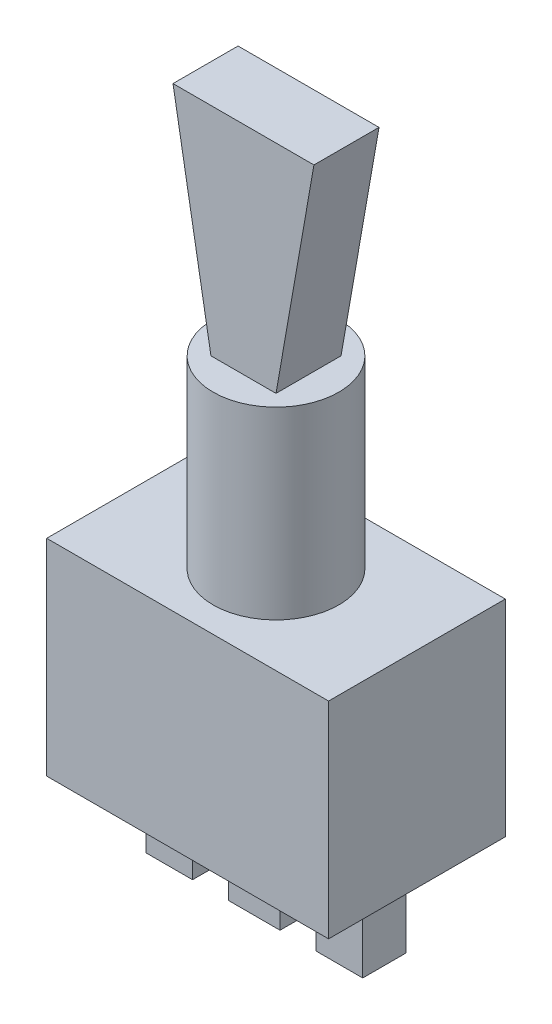
ISO-10303-21;
HEADER;
FILE_DESCRIPTION(('STEP AP214'),'2;1');
FILE_NAME('part.step','',(''),(''),'','','');
FILE_SCHEMA(('AUTOMOTIVE_DESIGN { 1 0 10303 214 1 1 1 1 }'));
ENDSEC;
DATA;
#1=APPLICATION_CONTEXT('core data for automotive mechanical design processes');
#2=APPLICATION_PROTOCOL_DEFINITION('international standard','automotive_design',2000,#1);
#3=PRODUCT_CONTEXT('',#1,'mechanical');
#4=PRODUCT('Part','Part','',(#3));
#5=PRODUCT_RELATED_PRODUCT_CATEGORY('part','',(#4));
#6=PRODUCT_DEFINITION_FORMATION('','',#4);
#7=PRODUCT_DEFINITION_CONTEXT('part definition',#1,'design');
#8=PRODUCT_DEFINITION('design','',#6,#7);
#9=PRODUCT_DEFINITION_SHAPE('','',#8);
#10=(LENGTH_UNIT() NAMED_UNIT(*) SI_UNIT(.MILLI.,.METRE.));
#11=(NAMED_UNIT(*) PLANE_ANGLE_UNIT() SI_UNIT($,.RADIAN.));
#12=(NAMED_UNIT(*) SI_UNIT($,.STERADIAN.) SOLID_ANGLE_UNIT());
#13=UNCERTAINTY_MEASURE_WITH_UNIT(LENGTH_MEASURE(1.E-05),#10,'distance_accuracy_value','');
#14=(GEOMETRIC_REPRESENTATION_CONTEXT(3) GLOBAL_UNCERTAINTY_ASSIGNED_CONTEXT((#13)) GLOBAL_UNIT_ASSIGNED_CONTEXT((#10,
#11,#12)) REPRESENTATION_CONTEXT('',''));
#15=CARTESIAN_POINT('',(0.,0.,0.));
#16=DIRECTION('',(0.,0.,1.));
#17=DIRECTION('',(1.,0.,0.));
#18=AXIS2_PLACEMENT_3D('',#15,#16,#17);
#19=CARTESIAN_POINT('',(-5.,-13.35,1.));
#20=DIRECTION('',(0.,0.,-1.));
#21=DIRECTION('',(-1.,0.,0.));
#22=AXIS2_PLACEMENT_3D('',#19,#20,#21);
#23=PLANE('',#22);
#24=DIRECTION('',(-1.,0.,0.));
#25=VECTOR('',#24,1.);
#26=CARTESIAN_POINT('',(-5.,-13.35,1.));
#27=LINE('',#26,#25);
#28=CARTESIAN_POINT('',(-2.84872806599769,-13.35,1.));
#29=VERTEX_POINT('',#28);
#30=CARTESIAN_POINT('',(-5.,-13.35,1.));
#31=VERTEX_POINT('',#30);
#32=EDGE_CURVE('E245',#29,#31,#27,.T.);
#33=ORIENTED_EDGE('',*,*,#32,.F.);
#34=DIRECTION('',(0.,1.,0.));
#35=VECTOR('',#34,1.);
#36=CARTESIAN_POINT('',(-2.84872806599769,-13.35,1.));
#37=LINE('',#36,#35);
#38=CARTESIAN_POINT('',(-2.84872806599769,-9.5,1.));
#39=VERTEX_POINT('',#38);
#40=EDGE_CURVE('E258',#29,#39,#37,.T.);
#41=ORIENTED_EDGE('',*,*,#40,.T.);
#42=DIRECTION('',(-1.,0.,0.));
#43=VECTOR('',#42,1.);
#44=CARTESIAN_POINT('',(-5.,-9.5,1.));
#45=LINE('',#44,#43);
#46=CARTESIAN_POINT('',(-5.,-9.5,1.));
#47=VERTEX_POINT('',#46);
#48=EDGE_CURVE('E270',#39,#47,#45,.T.);
#49=ORIENTED_EDGE('',*,*,#48,.T.);
#50=DIRECTION('',(0.,1.,0.));
#51=VECTOR('',#50,1.);
#52=CARTESIAN_POINT('',(-5.,-13.35,1.));
#53=LINE('',#52,#51);
#54=EDGE_CURVE('E288',#31,#47,#53,.T.);
#55=ORIENTED_EDGE('',*,*,#54,.F.);
#56=EDGE_LOOP('',(#33,#41,#49,#55));
#57=FACE_BOUND('',#56,.T.);
#58=ADVANCED_FACE('F38',(#57),#23,.F.);
#59=CARTESIAN_POINT('',(1.18594295638461,-9.5,1.));
#60=VERTEX_POINT('',#59);
#61=CARTESIAN_POINT('',(-1.18594295638461,-9.5,1.));
#62=VERTEX_POINT('',#61);
#63=EDGE_CURVE('E272',#60,#62,#45,.T.);
#64=ORIENTED_EDGE('',*,*,#63,.T.);
#65=DIRECTION('',(0.,-1.,0.));
#66=VECTOR('',#65,1.);
#67=CARTESIAN_POINT('',(-1.18594295638461,-13.35,1.));
#68=LINE('',#67,#66);
#69=CARTESIAN_POINT('',(-1.18594295638461,-13.35,1.));
#70=VERTEX_POINT('',#69);
#71=EDGE_CURVE('E427',#62,#70,#68,.T.);
#72=ORIENTED_EDGE('',*,*,#71,.T.);
#73=CARTESIAN_POINT('',(1.18594295638461,-13.35,1.));
#74=VERTEX_POINT('',#73);
#75=EDGE_CURVE('E254',#74,#70,#27,.T.);
#76=ORIENTED_EDGE('',*,*,#75,.F.);
#77=DIRECTION('',(0.,1.,0.));
#78=VECTOR('',#77,1.);
#79=CARTESIAN_POINT('',(1.18594295638461,-13.35,1.));
#80=LINE('',#79,#78);
#81=EDGE_CURVE('E420',#74,#60,#80,.T.);
#82=ORIENTED_EDGE('',*,*,#81,.T.);
#83=EDGE_LOOP('',(#64,#72,#76,#82));
#84=FACE_BOUND('',#83,.T.);
#85=ADVANCED_FACE('F448',(#84),#23,.F.);
#86=CARTESIAN_POINT('',(-5.,-13.35,-1.));
#87=DIRECTION('',(0.,0.,1.));
#88=DIRECTION('',(1.,0.,0.));
#89=AXIS2_PLACEMENT_3D('',#86,#87,#88);
#90=PLANE('',#89);
#91=DIRECTION('',(1.,0.,0.));
#92=VECTOR('',#91,1.);
#93=CARTESIAN_POINT('',(-5.,-9.5,-1.));
#94=LINE('',#93,#92);
#95=CARTESIAN_POINT('',(-5.,-9.5,-1.));
#96=VERTEX_POINT('',#95);
#97=CARTESIAN_POINT('',(-2.84872806599769,-9.5,-1.));
#98=VERTEX_POINT('',#97);
#99=EDGE_CURVE('E231',#96,#98,#94,.T.);
#100=ORIENTED_EDGE('',*,*,#99,.T.);
#101=DIRECTION('',(0.,-1.,0.));
#102=VECTOR('',#101,1.);
#103=CARTESIAN_POINT('',(-2.84872806599769,-13.35,-1.));
#104=LINE('',#103,#102);
#105=CARTESIAN_POINT('',(-2.84872806599769,-13.35,-1.));
#106=VERTEX_POINT('',#105);
#107=EDGE_CURVE('E429',#98,#106,#104,.T.);
#108=ORIENTED_EDGE('',*,*,#107,.T.);
#109=DIRECTION('',(1.,0.,0.));
#110=VECTOR('',#109,1.);
#111=CARTESIAN_POINT('',(-5.,-13.35,-1.));
#112=LINE('',#111,#110);
#113=CARTESIAN_POINT('',(-5.,-13.35,-1.));
#114=VERTEX_POINT('',#113);
#115=EDGE_CURVE('E264',#114,#106,#112,.T.);
#116=ORIENTED_EDGE('',*,*,#115,.F.);
#117=DIRECTION('',(0.,1.,0.));
#118=VECTOR('',#117,1.);
#119=CARTESIAN_POINT('',(-5.,-13.35,-1.));
#120=LINE('',#119,#118);
#121=EDGE_CURVE('E297',#114,#96,#120,.T.);
#122=ORIENTED_EDGE('',*,*,#121,.T.);
#123=EDGE_LOOP('',(#100,#108,#116,#122));
#124=FACE_BOUND('',#123,.T.);
#125=ADVANCED_FACE('F431',(#124),#90,.F.);
#126=CARTESIAN_POINT('',(-1.18594295638461,-13.35,-1.));
#127=VERTEX_POINT('',#126);
#128=CARTESIAN_POINT('',(1.18594295638461,-13.35,-1.));
#129=VERTEX_POINT('',#128);
#130=EDGE_CURVE('E268',#127,#129,#112,.T.);
#131=ORIENTED_EDGE('',*,*,#130,.F.);
#132=DIRECTION('',(0.,1.,0.));
#133=VECTOR('',#132,1.);
#134=CARTESIAN_POINT('',(-1.18594295638461,-13.35,-1.));
#135=LINE('',#134,#133);
#136=CARTESIAN_POINT('',(-1.18594295638461,-9.5,-1.));
#137=VERTEX_POINT('',#136);
#138=EDGE_CURVE('E68',#127,#137,#135,.T.);
#139=ORIENTED_EDGE('',*,*,#138,.T.);
#140=CARTESIAN_POINT('',(1.18594295638461,-9.5,-1.));
#141=VERTEX_POINT('',#140);
#142=EDGE_CURVE('E228',#137,#141,#94,.T.);
#143=ORIENTED_EDGE('',*,*,#142,.T.);
#144=DIRECTION('',(0.,-1.,0.));
#145=VECTOR('',#144,1.);
#146=CARTESIAN_POINT('',(1.18594295638461,-13.35,-1.));
#147=LINE('',#146,#145);
#148=EDGE_CURVE('E410',#141,#129,#147,.T.);
#149=ORIENTED_EDGE('',*,*,#148,.T.);
#150=EDGE_LOOP('',(#131,#139,#143,#149));
#151=FACE_BOUND('',#150,.T.);
#152=ADVANCED_FACE('F408',(#151),#90,.F.);
#153=CARTESIAN_POINT('',(0.,-13.35,0.));
#154=DIRECTION('',(0.,1.,0.));
#155=DIRECTION('',(0.,0.,1.));
#156=AXIS2_PLACEMENT_3D('',#153,#154,#155);
#157=PLANE('',#156);
#158=ORIENTED_EDGE('',*,*,#115,.T.);
#159=DIRECTION('',(0.,0.,1.));
#160=VECTOR('',#159,1.);
#161=CARTESIAN_POINT('',(-2.84872806599769,-13.35,0.));
#162=LINE('',#161,#160);
#163=EDGE_CURVE('E11',#106,#29,#162,.T.);
#164=ORIENTED_EDGE('',*,*,#163,.T.);
#165=ORIENTED_EDGE('',*,*,#32,.T.);
#166=DIRECTION('',(0.,0.,-1.));
#167=VECTOR('',#166,1.);
#168=CARTESIAN_POINT('',(-5.,-13.35,-1.));
#169=LINE('',#168,#167);
#170=EDGE_CURVE('E262',#31,#114,#169,.T.);
#171=ORIENTED_EDGE('',*,*,#170,.T.);
#172=EDGE_LOOP('',(#158,#164,#165,#171));
#173=FACE_BOUND('',#172,.T.);
#174=ADVANCED_FACE('F434',(#173),#157,.F.);
#175=ORIENTED_EDGE('',*,*,#75,.T.);
#176=DIRECTION('',(0.,0.,-1.));
#177=VECTOR('',#176,1.);
#178=CARTESIAN_POINT('',(-1.18594295638461,-13.35,0.));
#179=LINE('',#178,#177);
#180=EDGE_CURVE('E47',#70,#127,#179,.T.);
#181=ORIENTED_EDGE('',*,*,#180,.T.);
#182=ORIENTED_EDGE('',*,*,#130,.T.);
#183=DIRECTION('',(0.,0.,1.));
#184=VECTOR('',#183,1.);
#185=CARTESIAN_POINT('',(1.18594295638461,-13.35,0.));
#186=LINE('',#185,#184);
#187=EDGE_CURVE('E394',#129,#74,#186,.T.);
#188=ORIENTED_EDGE('',*,*,#187,.T.);
#189=EDGE_LOOP('',(#175,#181,#182,#188));
#190=FACE_BOUND('',#189,.T.);
#191=ADVANCED_FACE('F403',(#190),#157,.F.);
#192=CARTESIAN_POINT('',(0.,8.5,0.));
#193=DIRECTION('',(0.,1.,0.));
#194=DIRECTION('',(0.,0.,1.));
#195=AXIS2_PLACEMENT_3D('',#192,#193,#194);
#196=PLANE('',#195);
#197=CARTESIAN_POINT('',(0.,8.5,0.));
#198=DIRECTION('',(0.,1.,0.));
#199=DIRECTION('',(0.,0.,1.));
#200=AXIS2_PLACEMENT_3D('',#197,#198,#199);
#201=CIRCLE('',#200,2.9);
#202=CARTESIAN_POINT('',(0.,8.5,2.9));
#203=VERTEX_POINT('',#202);
#204=EDGE_CURVE('E338',#203,#203,#201,.T.);
#205=ORIENTED_EDGE('',*,*,#204,.T.);
#206=EDGE_LOOP('',(#205));
#207=FACE_BOUND('',#206,.T.);
#208=DIRECTION('',(1.,0.,0.));
#209=VECTOR('',#208,1.);
#210=CARTESIAN_POINT('',(1.5,8.5,-1.5));
#211=LINE('',#210,#209);
#212=CARTESIAN_POINT('',(-1.5,8.5,-1.5));
#213=VERTEX_POINT('',#212);
#214=CARTESIAN_POINT('',(1.5,8.5,-1.5));
#215=VERTEX_POINT('',#214);
#216=EDGE_CURVE('E329',#213,#215,#211,.T.);
#217=ORIENTED_EDGE('',*,*,#216,.T.);
#218=DIRECTION('',(0.,0.,1.));
#219=VECTOR('',#218,1.);
#220=CARTESIAN_POINT('',(1.5,8.5,-1.5));
#221=LINE('',#220,#219);
#222=CARTESIAN_POINT('',(1.5,8.5,1.5));
#223=VERTEX_POINT('',#222);
#224=EDGE_CURVE('E334',#215,#223,#221,.T.);
#225=ORIENTED_EDGE('',*,*,#224,.T.);
#226=DIRECTION('',(1.,0.,0.));
#227=VECTOR('',#226,1.);
#228=CARTESIAN_POINT('',(1.5,8.5,1.5));
#229=LINE('',#228,#227);
#230=CARTESIAN_POINT('',(-1.5,8.5,1.5));
#231=VERTEX_POINT('',#230);
#232=EDGE_CURVE('E315',#231,#223,#229,.T.);
#233=ORIENTED_EDGE('',*,*,#232,.F.);
#234=DIRECTION('',(0.,0.,1.));
#235=VECTOR('',#234,1.);
#236=CARTESIAN_POINT('',(-1.5,8.5,-1.5));
#237=LINE('',#236,#235);
#238=EDGE_CURVE('E339',#213,#231,#237,.T.);
#239=ORIENTED_EDGE('',*,*,#238,.F.);
#240=EDGE_LOOP('',(#217,#225,#233,#239));
#241=FACE_BOUND('',#240,.T.);
#242=ADVANCED_FACE('F492',(#207,#241),#196,.T.);
#243=CARTESIAN_POINT('',(6.5,-9.5,4.075));
#244=DIRECTION('',(1.,0.,0.));
#245=DIRECTION('',(0.,0.,-1.));
#246=AXIS2_PLACEMENT_3D('',#243,#244,#245);
#247=PLANE('',#246);
#248=DIRECTION('',(0.,0.,-1.));
#249=VECTOR('',#248,1.);
#250=CARTESIAN_POINT('',(6.5,0.,4.075));
#251=LINE('',#250,#249);
#252=CARTESIAN_POINT('',(6.5,0.,4.075));
#253=VERTEX_POINT('',#252);
#254=CARTESIAN_POINT('',(6.5,0.,-4.075));
#255=VERTEX_POINT('',#254);
#256=EDGE_CURVE('E350',#253,#255,#251,.T.);
#257=ORIENTED_EDGE('',*,*,#256,.F.);
#258=DIRECTION('',(0.,1.,0.));
#259=VECTOR('',#258,1.);
#260=CARTESIAN_POINT('',(6.5,-9.5,4.075));
#261=LINE('',#260,#259);
#262=CARTESIAN_POINT('',(6.5,-9.5,4.075));
#263=VERTEX_POINT('',#262);
#264=EDGE_CURVE('E356',#263,#253,#261,.T.);
#265=ORIENTED_EDGE('',*,*,#264,.F.);
#266=DIRECTION('',(0.,0.,-1.));
#267=VECTOR('',#266,1.);
#268=CARTESIAN_POINT('',(6.5,-9.5,4.075));
#269=LINE('',#268,#267);
#270=CARTESIAN_POINT('',(6.5,-9.5,-4.075));
#271=VERTEX_POINT('',#270);
#272=EDGE_CURVE('E357',#263,#271,#269,.T.);
#273=ORIENTED_EDGE('',*,*,#272,.T.);
#274=DIRECTION('',(0.,1.,0.));
#275=VECTOR('',#274,1.);
#276=CARTESIAN_POINT('',(6.5,-9.5,-4.075));
#277=LINE('',#276,#275);
#278=EDGE_CURVE('E371',#271,#255,#277,.T.);
#279=ORIENTED_EDGE('',*,*,#278,.T.);
#280=EDGE_LOOP('',(#257,#265,#273,#279));
#281=FACE_BOUND('',#280,.T.);
#282=ADVANCED_FACE('F40',(#281),#247,.T.);
#283=CARTESIAN_POINT('',(-6.5,-9.5,4.075));
#284=DIRECTION('',(0.,0.,1.));
#285=DIRECTION('',(1.,0.,0.));
#286=AXIS2_PLACEMENT_3D('',#283,#284,#285);
#287=PLANE('',#286);
#288=DIRECTION('',(1.,0.,0.));
#289=VECTOR('',#288,1.);
#290=CARTESIAN_POINT('',(-6.5,0.,4.075));
#291=LINE('',#290,#289);
#292=CARTESIAN_POINT('',(-6.5,0.,4.075));
#293=VERTEX_POINT('',#292);
#294=EDGE_CURVE('E362',#293,#253,#291,.T.);
#295=ORIENTED_EDGE('',*,*,#294,.F.);
#296=DIRECTION('',(0.,1.,0.));
#297=VECTOR('',#296,1.);
#298=CARTESIAN_POINT('',(-6.5,-9.5,4.075));
#299=LINE('',#298,#297);
#300=CARTESIAN_POINT('',(-6.5,-9.5,4.075));
#301=VERTEX_POINT('',#300);
#302=EDGE_CURVE('E387',#301,#293,#299,.T.);
#303=ORIENTED_EDGE('',*,*,#302,.F.);
#304=DIRECTION('',(1.,0.,0.));
#305=VECTOR('',#304,1.);
#306=CARTESIAN_POINT('',(-6.5,-9.5,4.075));
#307=LINE('',#306,#305);
#308=EDGE_CURVE('E368',#301,#263,#307,.T.);
#309=ORIENTED_EDGE('',*,*,#308,.T.);
#310=ORIENTED_EDGE('',*,*,#264,.T.);
#311=EDGE_LOOP('',(#295,#303,#309,#310));
#312=FACE_BOUND('',#311,.T.);
#313=ADVANCED_FACE('F506',(#312),#287,.T.);
#314=CARTESIAN_POINT('',(-6.5,-9.5,4.075));
#315=DIRECTION('',(-1.,0.,0.));
#316=DIRECTION('',(0.,0.,1.));
#317=AXIS2_PLACEMENT_3D('',#314,#315,#316);
#318=PLANE('',#317);
#319=DIRECTION('',(0.,0.,1.));
#320=VECTOR('',#319,1.);
#321=CARTESIAN_POINT('',(-6.5,0.,4.075));
#322=LINE('',#321,#320);
#323=CARTESIAN_POINT('',(-6.5,0.,-4.075));
#324=VERTEX_POINT('',#323);
#325=EDGE_CURVE('E379',#324,#293,#322,.T.);
#326=ORIENTED_EDGE('',*,*,#325,.F.);
#327=DIRECTION('',(0.,1.,0.));
#328=VECTOR('',#327,1.);
#329=CARTESIAN_POINT('',(-6.5,-9.5,-4.075));
#330=LINE('',#329,#328);
#331=CARTESIAN_POINT('',(-6.5,-9.5,-4.075));
#332=VERTEX_POINT('',#331);
#333=EDGE_CURVE('E389',#332,#324,#330,.T.);
#334=ORIENTED_EDGE('',*,*,#333,.F.);
#335=DIRECTION('',(0.,0.,1.));
#336=VECTOR('',#335,1.);
#337=CARTESIAN_POINT('',(-6.5,-9.5,4.075));
#338=LINE('',#337,#336);
#339=EDGE_CURVE('E365',#332,#301,#338,.T.);
#340=ORIENTED_EDGE('',*,*,#339,.T.);
#341=ORIENTED_EDGE('',*,*,#302,.T.);
#342=EDGE_LOOP('',(#326,#334,#340,#341));
#343=FACE_BOUND('',#342,.T.);
#344=ADVANCED_FACE('F509',(#343),#318,.T.);
#345=CARTESIAN_POINT('',(-6.5,-9.5,-4.075));
#346=DIRECTION('',(0.,0.,-1.));
#347=DIRECTION('',(-1.,0.,0.));
#348=AXIS2_PLACEMENT_3D('',#345,#346,#347);
#349=PLANE('',#348);
#350=DIRECTION('',(-1.,0.,0.));
#351=VECTOR('',#350,1.);
#352=CARTESIAN_POINT('',(-6.5,0.,-4.075));
#353=LINE('',#352,#351);
#354=EDGE_CURVE('E375',#255,#324,#353,.T.);
#355=ORIENTED_EDGE('',*,*,#354,.F.);
#356=ORIENTED_EDGE('',*,*,#278,.F.);
#357=DIRECTION('',(-1.,0.,0.));
#358=VECTOR('',#357,1.);
#359=CARTESIAN_POINT('',(-6.5,-9.5,-4.075));
#360=LINE('',#359,#358);
#361=EDGE_CURVE('E361',#271,#332,#360,.T.);
#362=ORIENTED_EDGE('',*,*,#361,.T.);
#363=ORIENTED_EDGE('',*,*,#333,.T.);
#364=EDGE_LOOP('',(#355,#356,#362,#363));
#365=FACE_BOUND('',#364,.T.);
#366=ADVANCED_FACE('F502',(#365),#349,.T.);
#367=CARTESIAN_POINT('',(0.,-9.5,0.));
#368=DIRECTION('',(0.,-1.,0.));
#369=DIRECTION('',(0.,0.,-1.));
#370=AXIS2_PLACEMENT_3D('',#367,#368,#369);
#371=PLANE('',#370);
#372=ORIENTED_EDGE('',*,*,#48,.F.);
#373=DIRECTION('',(0.,0.,1.));
#374=VECTOR('',#373,1.);
#375=CARTESIAN_POINT('',(-2.84872806599769,-9.5,-4.075));
#376=LINE('',#375,#374);
#377=EDGE_CURVE('E220',#98,#39,#376,.T.);
#378=ORIENTED_EDGE('',*,*,#377,.F.);
#379=ORIENTED_EDGE('',*,*,#99,.F.);
#380=DIRECTION('',(0.,0.,-1.));
#381=VECTOR('',#380,1.);
#382=CARTESIAN_POINT('',(-5.,-9.5,-1.));
#383=LINE('',#382,#381);
#384=EDGE_CURVE('E229',#47,#96,#383,.T.);
#385=ORIENTED_EDGE('',*,*,#384,.F.);
#386=EDGE_LOOP('',(#372,#378,#379,#385));
#387=FACE_BOUND('',#386,.T.);
#388=ORIENTED_EDGE('',*,*,#142,.F.);
#389=DIRECTION('',(0.,0.,1.));
#390=VECTOR('',#389,1.);
#391=CARTESIAN_POINT('',(-1.18594295638461,-9.5,-4.075));
#392=LINE('',#391,#390);
#393=EDGE_CURVE('E436',#137,#62,#392,.T.);
#394=ORIENTED_EDGE('',*,*,#393,.T.);
#395=ORIENTED_EDGE('',*,*,#63,.F.);
#396=DIRECTION('',(0.,0.,1.));
#397=VECTOR('',#396,1.);
#398=CARTESIAN_POINT('',(1.18594295638461,-9.5,-4.075));
#399=LINE('',#398,#397);
#400=EDGE_CURVE('E210',#141,#60,#399,.T.);
#401=ORIENTED_EDGE('',*,*,#400,.F.);
#402=EDGE_LOOP('',(#388,#394,#395,#401));
#403=FACE_BOUND('',#402,.T.);
#404=CARTESIAN_POINT('',(2.84872806599769,-9.5,-1.));
#405=VERTEX_POINT('',#404);
#406=CARTESIAN_POINT('',(5.,-9.5,-1.));
#407=VERTEX_POINT('',#406);
#408=EDGE_CURVE('E216',#405,#407,#94,.T.);
#409=ORIENTED_EDGE('',*,*,#408,.F.);
#410=DIRECTION('',(0.,0.,1.));
#411=VECTOR('',#410,1.);
#412=CARTESIAN_POINT('',(2.84872806599769,-9.5,-4.075));
#413=LINE('',#412,#411);
#414=CARTESIAN_POINT('',(2.84872806599769,-9.5,1.));
#415=VERTEX_POINT('',#414);
#416=EDGE_CURVE('E202',#405,#415,#413,.T.);
#417=ORIENTED_EDGE('',*,*,#416,.T.);
#418=CARTESIAN_POINT('',(5.,-9.5,1.));
#419=VERTEX_POINT('',#418);
#420=EDGE_CURVE('E235',#419,#415,#45,.T.);
#421=ORIENTED_EDGE('',*,*,#420,.F.);
#422=DIRECTION('',(0.,0.,1.));
#423=VECTOR('',#422,1.);
#424=CARTESIAN_POINT('',(5.,-9.5,-1.));
#425=LINE('',#424,#423);
#426=EDGE_CURVE('E225',#407,#419,#425,.T.);
#427=ORIENTED_EDGE('',*,*,#426,.F.);
#428=EDGE_LOOP('',(#409,#417,#421,#427));
#429=FACE_BOUND('',#428,.T.);
#430=ORIENTED_EDGE('',*,*,#339,.F.);
#431=ORIENTED_EDGE('',*,*,#361,.F.);
#432=ORIENTED_EDGE('',*,*,#272,.F.);
#433=ORIENTED_EDGE('',*,*,#308,.F.);
#434=EDGE_LOOP('',(#430,#431,#432,#433));
#435=FACE_BOUND('',#434,.T.);
#436=ADVANCED_FACE('F222',(#387,#403,#429,#435),#371,.T.);
#437=CARTESIAN_POINT('',(0.,0.,0.));
#438=DIRECTION('',(0.,-1.,0.));
#439=DIRECTION('',(0.,0.,-1.));
#440=AXIS2_PLACEMENT_3D('',#437,#438,#439);
#441=PLANE('',#440);
#442=CARTESIAN_POINT('',(0.,0.,0.));
#443=DIRECTION('',(0.,1.,0.));
#444=DIRECTION('',(0.,0.,1.));
#445=AXIS2_PLACEMENT_3D('',#442,#443,#444);
#446=CIRCLE('',#445,2.9);
#447=CARTESIAN_POINT('',(0.,0.,2.9));
#448=VERTEX_POINT('',#447);
#449=EDGE_CURVE('E351',#448,#448,#446,.T.);
#450=ORIENTED_EDGE('',*,*,#449,.F.);
#451=EDGE_LOOP('',(#450));
#452=FACE_BOUND('',#451,.T.);
#453=ORIENTED_EDGE('',*,*,#256,.T.);
#454=ORIENTED_EDGE('',*,*,#354,.T.);
#455=ORIENTED_EDGE('',*,*,#325,.T.);
#456=ORIENTED_EDGE('',*,*,#294,.T.);
#457=EDGE_LOOP('',(#453,#454,#455,#456));
#458=FACE_BOUND('',#457,.T.);
#459=ADVANCED_FACE('F498',(#452,#458),#441,.F.);
#460=CARTESIAN_POINT('',(0.,8.5,0.));
#461=DIRECTION('',(0.,-1.,0.));
#462=DIRECTION('',(0.,0.,-1.));
#463=AXIS2_PLACEMENT_3D('',#460,#461,#462);
#464=CYLINDRICAL_SURFACE('',#463,2.9);
#465=ORIENTED_EDGE('',*,*,#204,.F.);
#466=EDGE_LOOP('',(#465));
#467=FACE_BOUND('',#466,.T.);
#468=ORIENTED_EDGE('',*,*,#449,.T.);
#469=EDGE_LOOP('',(#468));
#470=FACE_BOUND('',#469,.T.);
#471=ADVANCED_FACE('F490',(#467,#470),#464,.T.);
#472=CARTESIAN_POINT('',(1.5,8.5,-1.5));
#473=DIRECTION('',(0.985030467155704,-0.172380331752248,0.));
#474=DIRECTION('',(0.172380331752248,0.985030467155704,0.));
#475=AXIS2_PLACEMENT_3D('',#472,#473,#474);
#476=PLANE('',#475);
#477=DIRECTION('',(0.,0.,1.));
#478=VECTOR('',#477,1.);
#479=CARTESIAN_POINT('',(3.25,18.5,-1.5));
#480=LINE('',#479,#478);
#481=CARTESIAN_POINT('',(3.25,18.5,-1.5));
#482=VERTEX_POINT('',#481);
#483=CARTESIAN_POINT('',(3.25,18.5,1.5));
#484=VERTEX_POINT('',#483);
#485=EDGE_CURVE('E333',#482,#484,#480,.T.);
#486=ORIENTED_EDGE('',*,*,#485,.T.);
#487=DIRECTION('',(0.172380331752248,0.985030467155704,0.));
#488=VECTOR('',#487,1.);
#489=CARTESIAN_POINT('',(1.5,8.5,1.5));
#490=LINE('',#489,#488);
#491=EDGE_CURVE('E300',#223,#484,#490,.T.);
#492=ORIENTED_EDGE('',*,*,#491,.F.);
#493=ORIENTED_EDGE('',*,*,#224,.F.);
#494=DIRECTION('',(0.172380331752248,0.985030467155704,0.));
#495=VECTOR('',#494,1.);
#496=CARTESIAN_POINT('',(1.5,8.5,-1.5));
#497=LINE('',#496,#495);
#498=EDGE_CURVE('E318',#215,#482,#497,.T.);
#499=ORIENTED_EDGE('',*,*,#498,.T.);
#500=EDGE_LOOP('',(#486,#492,#493,#499));
#501=FACE_BOUND('',#500,.T.);
#502=ADVANCED_FACE('F483',(#501),#476,.T.);
#503=CARTESIAN_POINT('',(-1.5,8.5,-1.5));
#504=DIRECTION('',(-0.985030467155704,-0.172380331752248,0.));
#505=DIRECTION('',(0.172380331752248,-0.985030467155704,0.));
#506=AXIS2_PLACEMENT_3D('',#503,#504,#505);
#507=PLANE('',#506);
#508=ORIENTED_EDGE('',*,*,#238,.T.);
#509=DIRECTION('',(0.172380331752248,-0.985030467155704,0.));
#510=VECTOR('',#509,1.);
#511=CARTESIAN_POINT('',(-1.5,8.5,1.5));
#512=LINE('',#511,#510);
#513=CARTESIAN_POINT('',(-3.25,18.5,1.5));
#514=VERTEX_POINT('',#513);
#515=EDGE_CURVE('E311',#514,#231,#512,.T.);
#516=ORIENTED_EDGE('',*,*,#515,.F.);
#517=DIRECTION('',(0.,0.,1.));
#518=VECTOR('',#517,1.);
#519=CARTESIAN_POINT('',(-3.25,18.5,-1.5));
#520=LINE('',#519,#518);
#521=CARTESIAN_POINT('',(-3.25,18.5,-1.5));
#522=VERTEX_POINT('',#521);
#523=EDGE_CURVE('E342',#522,#514,#520,.T.);
#524=ORIENTED_EDGE('',*,*,#523,.F.);
#525=DIRECTION('',(0.172380331752248,-0.985030467155704,0.));
#526=VECTOR('',#525,1.);
#527=CARTESIAN_POINT('',(-1.5,8.5,-1.5));
#528=LINE('',#527,#526);
#529=EDGE_CURVE('E326',#522,#213,#528,.T.);
#530=ORIENTED_EDGE('',*,*,#529,.T.);
#531=EDGE_LOOP('',(#508,#516,#524,#530));
#532=FACE_BOUND('',#531,.T.);
#533=ADVANCED_FACE('F480',(#532),#507,.T.);
#534=CARTESIAN_POINT('',(3.25,18.5,-1.5));
#535=DIRECTION('',(0.,1.,0.));
#536=DIRECTION('',(0.,0.,1.));
#537=AXIS2_PLACEMENT_3D('',#534,#535,#536);
#538=PLANE('',#537);
#539=ORIENTED_EDGE('',*,*,#523,.T.);
#540=DIRECTION('',(-1.,0.,0.));
#541=VECTOR('',#540,1.);
#542=CARTESIAN_POINT('',(3.25,18.5,1.5));
#543=LINE('',#542,#541);
#544=EDGE_CURVE('E307',#484,#514,#543,.T.);
#545=ORIENTED_EDGE('',*,*,#544,.F.);
#546=ORIENTED_EDGE('',*,*,#485,.F.);
#547=DIRECTION('',(-1.,0.,0.));
#548=VECTOR('',#547,1.);
#549=CARTESIAN_POINT('',(3.25,18.5,-1.5));
#550=LINE('',#549,#548);
#551=EDGE_CURVE('E322',#482,#522,#550,.T.);
#552=ORIENTED_EDGE('',*,*,#551,.T.);
#553=EDGE_LOOP('',(#539,#545,#546,#552));
#554=FACE_BOUND('',#553,.T.);
#555=ADVANCED_FACE('F478',(#554),#538,.T.);
#556=CARTESIAN_POINT('',(0.,0.,-1.5));
#557=DIRECTION('',(0.,0.,1.));
#558=DIRECTION('',(1.,0.,0.));
#559=AXIS2_PLACEMENT_3D('',#556,#557,#558);
#560=PLANE('',#559);
#561=ORIENTED_EDGE('',*,*,#498,.F.);
#562=ORIENTED_EDGE('',*,*,#216,.F.);
#563=ORIENTED_EDGE('',*,*,#529,.F.);
#564=ORIENTED_EDGE('',*,*,#551,.F.);
#565=EDGE_LOOP('',(#561,#562,#563,#564));
#566=FACE_BOUND('',#565,.T.);
#567=ADVANCED_FACE('F472',(#566),#560,.F.);
#568=CARTESIAN_POINT('',(0.,0.,1.5));
#569=DIRECTION('',(0.,0.,1.));
#570=DIRECTION('',(1.,0.,0.));
#571=AXIS2_PLACEMENT_3D('',#568,#569,#570);
#572=PLANE('',#571);
#573=ORIENTED_EDGE('',*,*,#491,.T.);
#574=ORIENTED_EDGE('',*,*,#544,.T.);
#575=ORIENTED_EDGE('',*,*,#515,.T.);
#576=ORIENTED_EDGE('',*,*,#232,.T.);
#577=EDGE_LOOP('',(#573,#574,#575,#576));
#578=FACE_BOUND('',#577,.T.);
#579=ADVANCED_FACE('F468',(#578),#572,.T.);
#580=CARTESIAN_POINT('',(5.,-13.35,-1.));
#581=DIRECTION('',(-1.,0.,0.));
#582=DIRECTION('',(0.,0.,1.));
#583=AXIS2_PLACEMENT_3D('',#580,#581,#582);
#584=PLANE('',#583);
#585=ORIENTED_EDGE('',*,*,#426,.T.);
#586=DIRECTION('',(0.,1.,0.));
#587=VECTOR('',#586,1.);
#588=CARTESIAN_POINT('',(5.,-13.35,1.));
#589=LINE('',#588,#587);
#590=CARTESIAN_POINT('',(5.,-13.35,1.));
#591=VERTEX_POINT('',#590);
#592=EDGE_CURVE('E296',#591,#419,#589,.T.);
#593=ORIENTED_EDGE('',*,*,#592,.F.);
#594=DIRECTION('',(0.,0.,1.));
#595=VECTOR('',#594,1.);
#596=CARTESIAN_POINT('',(5.,-13.35,-1.));
#597=LINE('',#596,#595);
#598=CARTESIAN_POINT('',(5.,-13.35,-1.));
#599=VERTEX_POINT('',#598);
#600=EDGE_CURVE('E239',#599,#591,#597,.T.);
#601=ORIENTED_EDGE('',*,*,#600,.F.);
#602=DIRECTION('',(0.,1.,0.));
#603=VECTOR('',#602,1.);
#604=CARTESIAN_POINT('',(5.,-13.35,-1.));
#605=LINE('',#604,#603);
#606=EDGE_CURVE('E267',#599,#407,#605,.T.);
#607=ORIENTED_EDGE('',*,*,#606,.T.);
#608=EDGE_LOOP('',(#585,#593,#601,#607));
#609=FACE_BOUND('',#608,.T.);
#610=ADVANCED_FACE('F415',(#609),#584,.F.);
#611=ORIENTED_EDGE('',*,*,#420,.T.);
#612=DIRECTION('',(0.,-1.,0.));
#613=VECTOR('',#612,1.);
#614=CARTESIAN_POINT('',(2.84872806599769,-13.35,1.));
#615=LINE('',#614,#613);
#616=CARTESIAN_POINT('',(2.84872806599769,-13.35,1.));
#617=VERTEX_POINT('',#616);
#618=EDGE_CURVE('E205',#415,#617,#615,.T.);
#619=ORIENTED_EDGE('',*,*,#618,.T.);
#620=EDGE_CURVE('E256',#591,#617,#27,.T.);
#621=ORIENTED_EDGE('',*,*,#620,.F.);
#622=ORIENTED_EDGE('',*,*,#592,.T.);
#623=EDGE_LOOP('',(#611,#619,#621,#622));
#624=FACE_BOUND('',#623,.T.);
#625=ADVANCED_FACE('F416',(#624),#23,.F.);
#626=CARTESIAN_POINT('',(-5.,-13.35,-1.));
#627=DIRECTION('',(1.,0.,0.));
#628=DIRECTION('',(0.,0.,-1.));
#629=AXIS2_PLACEMENT_3D('',#626,#627,#628);
#630=PLANE('',#629);
#631=ORIENTED_EDGE('',*,*,#384,.T.);
#632=ORIENTED_EDGE('',*,*,#121,.F.);
#633=ORIENTED_EDGE('',*,*,#170,.F.);
#634=ORIENTED_EDGE('',*,*,#54,.T.);
#635=EDGE_LOOP('',(#631,#632,#633,#634));
#636=FACE_BOUND('',#635,.T.);
#637=ADVANCED_FACE('F295',(#636),#630,.F.);
#638=CARTESIAN_POINT('',(2.84872806599769,-13.35,-1.));
#639=VERTEX_POINT('',#638);
#640=EDGE_CURVE('E218',#639,#599,#112,.T.);
#641=ORIENTED_EDGE('',*,*,#640,.F.);
#642=DIRECTION('',(0.,1.,0.));
#643=VECTOR('',#642,1.);
#644=CARTESIAN_POINT('',(2.84872806599769,-13.35,-1.));
#645=LINE('',#644,#643);
#646=EDGE_CURVE('E57',#639,#405,#645,.T.);
#647=ORIENTED_EDGE('',*,*,#646,.T.);
#648=ORIENTED_EDGE('',*,*,#408,.T.);
#649=ORIENTED_EDGE('',*,*,#606,.F.);
#650=EDGE_LOOP('',(#641,#647,#648,#649));
#651=FACE_BOUND('',#650,.T.);
#652=ADVANCED_FACE('F214',(#651),#90,.F.);
#653=ORIENTED_EDGE('',*,*,#620,.T.);
#654=DIRECTION('',(0.,0.,-1.));
#655=VECTOR('',#654,1.);
#656=CARTESIAN_POINT('',(2.84872806599769,-13.35,0.));
#657=LINE('',#656,#655);
#658=EDGE_CURVE('E355',#617,#639,#657,.T.);
#659=ORIENTED_EDGE('',*,*,#658,.T.);
#660=ORIENTED_EDGE('',*,*,#640,.T.);
#661=ORIENTED_EDGE('',*,*,#600,.T.);
#662=EDGE_LOOP('',(#653,#659,#660,#661));
#663=FACE_BOUND('',#662,.T.);
#664=ADVANCED_FACE('F413',(#663),#157,.F.);
#665=CARTESIAN_POINT('',(1.18594295638461,-13.35,-4.075));
#666=DIRECTION('',(-1.,0.,0.));
#667=DIRECTION('',(0.,0.,1.));
#668=AXIS2_PLACEMENT_3D('',#665,#666,#667);
#669=PLANE('',#668);
#670=ORIENTED_EDGE('',*,*,#187,.F.);
#671=ORIENTED_EDGE('',*,*,#148,.F.);
#672=ORIENTED_EDGE('',*,*,#400,.T.);
#673=ORIENTED_EDGE('',*,*,#81,.F.);
#674=EDGE_LOOP('',(#670,#671,#672,#673));
#675=FACE_BOUND('',#674,.T.);
#676=ADVANCED_FACE('F445',(#675),#669,.F.);
#677=CARTESIAN_POINT('',(2.84872806599769,-13.35,-4.075));
#678=DIRECTION('',(1.,0.,0.));
#679=DIRECTION('',(0.,0.,-1.));
#680=AXIS2_PLACEMENT_3D('',#677,#678,#679);
#681=PLANE('',#680);
#682=ORIENTED_EDGE('',*,*,#416,.F.);
#683=ORIENTED_EDGE('',*,*,#646,.F.);
#684=ORIENTED_EDGE('',*,*,#658,.F.);
#685=ORIENTED_EDGE('',*,*,#618,.F.);
#686=EDGE_LOOP('',(#682,#683,#684,#685));
#687=FACE_BOUND('',#686,.T.);
#688=ADVANCED_FACE('F203',(#687),#681,.F.);
#689=CARTESIAN_POINT('',(-2.84872806599769,-13.35,-4.075));
#690=DIRECTION('',(-1.,0.,0.));
#691=DIRECTION('',(0.,0.,1.));
#692=AXIS2_PLACEMENT_3D('',#689,#690,#691);
#693=PLANE('',#692);
#694=ORIENTED_EDGE('',*,*,#163,.F.);
#695=ORIENTED_EDGE('',*,*,#107,.F.);
#696=ORIENTED_EDGE('',*,*,#377,.T.);
#697=ORIENTED_EDGE('',*,*,#40,.F.);
#698=EDGE_LOOP('',(#694,#695,#696,#697));
#699=FACE_BOUND('',#698,.T.);
#700=ADVANCED_FACE('F435',(#699),#693,.F.);
#701=CARTESIAN_POINT('',(-1.18594295638461,-13.35,-4.075));
#702=DIRECTION('',(1.,0.,0.));
#703=DIRECTION('',(0.,0.,-1.));
#704=AXIS2_PLACEMENT_3D('',#701,#702,#703);
#705=PLANE('',#704);
#706=ORIENTED_EDGE('',*,*,#393,.F.);
#707=ORIENTED_EDGE('',*,*,#138,.F.);
#708=ORIENTED_EDGE('',*,*,#180,.F.);
#709=ORIENTED_EDGE('',*,*,#71,.F.);
#710=EDGE_LOOP('',(#706,#707,#708,#709));
#711=FACE_BOUND('',#710,.T.);
#712=ADVANCED_FACE('F449',(#711),#705,.F.);
#713=CLOSED_SHELL('',(#58,#85,#125,#152,#174,#191,#242,#282,#313,#344,#366,#436,#459,#471,#502,
#533,#555,#567,#579,#610,#625,#637,#652,#664,#676,#688,#700,#712));
#714=MANIFOLD_SOLID_BREP('B2',#713);
#715=ADVANCED_BREP_SHAPE_REPRESENTATION('',(#18,#714),#14);
#716=SHAPE_DEFINITION_REPRESENTATION(#9,#715);
ENDSEC;
END-ISO-10303-21;
